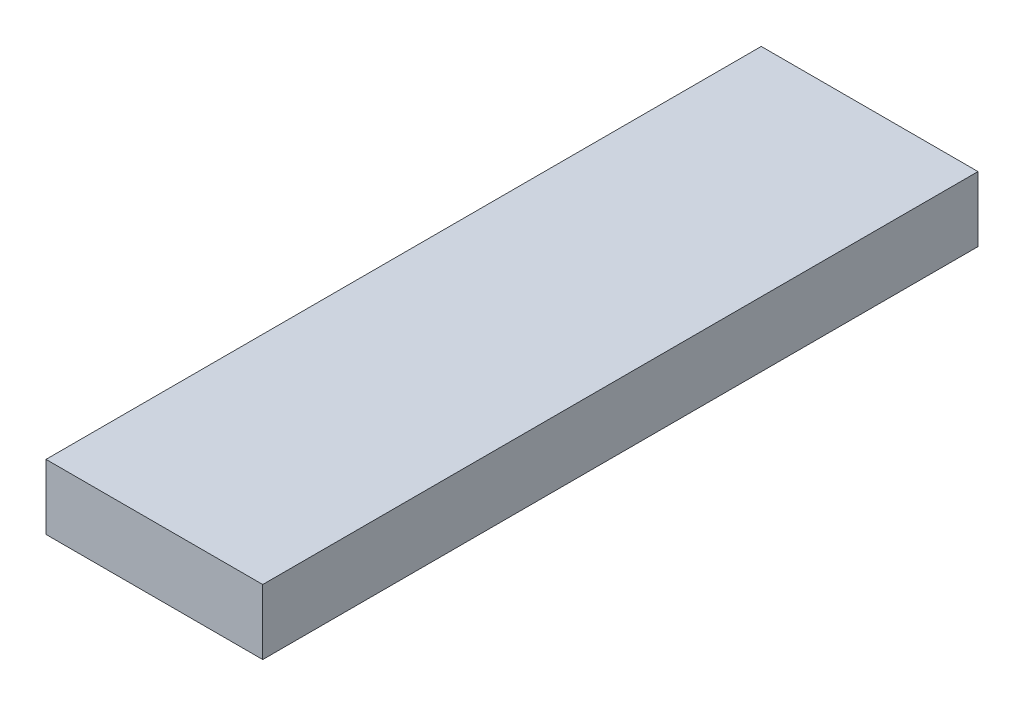
ISO-10303-21;
HEADER;
FILE_DESCRIPTION(('STEP AP214'),'2;1');
FILE_NAME('part.step','',(''),(''),'','','');
FILE_SCHEMA(('AUTOMOTIVE_DESIGN { 1 0 10303 214 1 1 1 1 }'));
ENDSEC;
DATA;
#1=APPLICATION_CONTEXT('core data for automotive mechanical design processes');
#2=APPLICATION_PROTOCOL_DEFINITION('international standard','automotive_design',2000,#1);
#3=PRODUCT_CONTEXT('',#1,'mechanical');
#4=PRODUCT('Part','Part','',(#3));
#5=PRODUCT_RELATED_PRODUCT_CATEGORY('part','',(#4));
#6=PRODUCT_DEFINITION_FORMATION('','',#4);
#7=PRODUCT_DEFINITION_CONTEXT('part definition',#1,'design');
#8=PRODUCT_DEFINITION('design','',#6,#7);
#9=PRODUCT_DEFINITION_SHAPE('','',#8);
#10=(LENGTH_UNIT() NAMED_UNIT(*) SI_UNIT(.MILLI.,.METRE.));
#11=(NAMED_UNIT(*) PLANE_ANGLE_UNIT() SI_UNIT($,.RADIAN.));
#12=(NAMED_UNIT(*) SI_UNIT($,.STERADIAN.) SOLID_ANGLE_UNIT());
#13=UNCERTAINTY_MEASURE_WITH_UNIT(LENGTH_MEASURE(1.E-05),#10,'distance_accuracy_value','');
#14=(GEOMETRIC_REPRESENTATION_CONTEXT(3) GLOBAL_UNCERTAINTY_ASSIGNED_CONTEXT((#13)) GLOBAL_UNIT_ASSIGNED_CONTEXT((#10,
#11,#12)) REPRESENTATION_CONTEXT('',''));
#15=CARTESIAN_POINT('',(0.,0.,0.));
#16=DIRECTION('',(0.,0.,1.));
#17=DIRECTION('',(1.,0.,0.));
#18=AXIS2_PLACEMENT_3D('',#15,#16,#17);
#19=CARTESIAN_POINT('',(5.,3.,16.5));
#20=DIRECTION('',(-1.,0.,0.));
#21=DIRECTION('',(0.,0.,1.));
#22=AXIS2_PLACEMENT_3D('',#19,#20,#21);
#23=PLANE('',#22);
#24=DIRECTION('',(0.,0.,-1.));
#25=VECTOR('',#24,1.);
#26=CARTESIAN_POINT('',(5.,0.,16.5));
#27=LINE('',#26,#25);
#28=CARTESIAN_POINT('',(5.,0.,16.5));
#29=VERTEX_POINT('',#28);
#30=CARTESIAN_POINT('',(5.,0.,-16.5));
#31=VERTEX_POINT('',#30);
#32=EDGE_CURVE('E96',#29,#31,#27,.T.);
#33=ORIENTED_EDGE('',*,*,#32,.T.);
#34=DIRECTION('',(0.,-1.,0.));
#35=VECTOR('',#34,1.);
#36=CARTESIAN_POINT('',(5.,3.,-16.5));
#37=LINE('',#36,#35);
#38=CARTESIAN_POINT('',(5.,3.,-16.5));
#39=VERTEX_POINT('',#38);
#40=EDGE_CURVE('E11',#39,#31,#37,.T.);
#41=ORIENTED_EDGE('',*,*,#40,.F.);
#42=DIRECTION('',(0.,0.,-1.));
#43=VECTOR('',#42,1.);
#44=CARTESIAN_POINT('',(5.,3.,16.5));
#45=LINE('',#44,#43);
#46=CARTESIAN_POINT('',(5.,3.,16.5));
#47=VERTEX_POINT('',#46);
#48=EDGE_CURVE('E84',#47,#39,#45,.T.);
#49=ORIENTED_EDGE('',*,*,#48,.F.);
#50=DIRECTION('',(0.,-1.,0.));
#51=VECTOR('',#50,1.);
#52=CARTESIAN_POINT('',(5.,3.,16.5));
#53=LINE('',#52,#51);
#54=EDGE_CURVE('E92',#47,#29,#53,.T.);
#55=ORIENTED_EDGE('',*,*,#54,.T.);
#56=EDGE_LOOP('',(#33,#41,#49,#55));
#57=FACE_BOUND('',#56,.T.);
#58=ADVANCED_FACE('F33',(#57),#23,.F.);
#59=CARTESIAN_POINT('',(-5.,3.,-16.5));
#60=DIRECTION('',(0.,0.,1.));
#61=DIRECTION('',(1.,0.,0.));
#62=AXIS2_PLACEMENT_3D('',#59,#60,#61);
#63=PLANE('',#62);
#64=DIRECTION('',(-1.,0.,0.));
#65=VECTOR('',#64,1.);
#66=CARTESIAN_POINT('',(-5.,0.,-16.5));
#67=LINE('',#66,#65);
#68=CARTESIAN_POINT('',(-5.,0.,-16.5));
#69=VERTEX_POINT('',#68);
#70=EDGE_CURVE('E88',#31,#69,#67,.T.);
#71=ORIENTED_EDGE('',*,*,#70,.T.);
#72=DIRECTION('',(0.,-1.,0.));
#73=VECTOR('',#72,1.);
#74=CARTESIAN_POINT('',(-5.,3.,-16.5));
#75=LINE('',#74,#73);
#76=CARTESIAN_POINT('',(-5.,3.,-16.5));
#77=VERTEX_POINT('',#76);
#78=EDGE_CURVE('E41',#77,#69,#75,.T.);
#79=ORIENTED_EDGE('',*,*,#78,.F.);
#80=DIRECTION('',(-1.,0.,0.));
#81=VECTOR('',#80,1.);
#82=CARTESIAN_POINT('',(-5.,3.,-16.5));
#83=LINE('',#82,#81);
#84=EDGE_CURVE('E79',#39,#77,#83,.T.);
#85=ORIENTED_EDGE('',*,*,#84,.F.);
#86=ORIENTED_EDGE('',*,*,#40,.T.);
#87=EDGE_LOOP('',(#71,#79,#85,#86));
#88=FACE_BOUND('',#87,.T.);
#89=ADVANCED_FACE('F87',(#88),#63,.F.);
#90=CARTESIAN_POINT('',(-5.,3.,16.5));
#91=DIRECTION('',(1.,0.,0.));
#92=DIRECTION('',(0.,0.,-1.));
#93=AXIS2_PLACEMENT_3D('',#90,#91,#92);
#94=PLANE('',#93);
#95=DIRECTION('',(0.,0.,1.));
#96=VECTOR('',#95,1.);
#97=CARTESIAN_POINT('',(-5.,0.,16.5));
#98=LINE('',#97,#96);
#99=CARTESIAN_POINT('',(-5.,0.,16.5));
#100=VERTEX_POINT('',#99);
#101=EDGE_CURVE('E66',#69,#100,#98,.T.);
#102=ORIENTED_EDGE('',*,*,#101,.T.);
#103=DIRECTION('',(0.,-1.,0.));
#104=VECTOR('',#103,1.);
#105=CARTESIAN_POINT('',(-5.,3.,16.5));
#106=LINE('',#105,#104);
#107=CARTESIAN_POINT('',(-5.,3.,16.5));
#108=VERTEX_POINT('',#107);
#109=EDGE_CURVE('E89',#108,#100,#106,.T.);
#110=ORIENTED_EDGE('',*,*,#109,.F.);
#111=DIRECTION('',(0.,0.,1.));
#112=VECTOR('',#111,1.);
#113=CARTESIAN_POINT('',(-5.,3.,16.5));
#114=LINE('',#113,#112);
#115=EDGE_CURVE('E82',#77,#108,#114,.T.);
#116=ORIENTED_EDGE('',*,*,#115,.F.);
#117=ORIENTED_EDGE('',*,*,#78,.T.);
#118=EDGE_LOOP('',(#102,#110,#116,#117));
#119=FACE_BOUND('',#118,.T.);
#120=ADVANCED_FACE('F90',(#119),#94,.F.);
#121=CARTESIAN_POINT('',(-5.,3.,16.5));
#122=DIRECTION('',(0.,0.,-1.));
#123=DIRECTION('',(-1.,0.,0.));
#124=AXIS2_PLACEMENT_3D('',#121,#122,#123);
#125=PLANE('',#124);
#126=DIRECTION('',(1.,0.,0.));
#127=VECTOR('',#126,1.);
#128=CARTESIAN_POINT('',(-5.,0.,16.5));
#129=LINE('',#128,#127);
#130=EDGE_CURVE('E72',#100,#29,#129,.T.);
#131=ORIENTED_EDGE('',*,*,#130,.T.);
#132=ORIENTED_EDGE('',*,*,#54,.F.);
#133=DIRECTION('',(1.,0.,0.));
#134=VECTOR('',#133,1.);
#135=CARTESIAN_POINT('',(-5.,3.,16.5));
#136=LINE('',#135,#134);
#137=EDGE_CURVE('E49',#108,#47,#136,.T.);
#138=ORIENTED_EDGE('',*,*,#137,.F.);
#139=ORIENTED_EDGE('',*,*,#109,.T.);
#140=EDGE_LOOP('',(#131,#132,#138,#139));
#141=FACE_BOUND('',#140,.T.);
#142=ADVANCED_FACE('F103',(#141),#125,.F.);
#143=CARTESIAN_POINT('',(0.,3.,0.));
#144=DIRECTION('',(0.,-1.,0.));
#145=DIRECTION('',(0.,0.,-1.));
#146=AXIS2_PLACEMENT_3D('',#143,#144,#145);
#147=PLANE('',#146);
#148=ORIENTED_EDGE('',*,*,#48,.T.);
#149=ORIENTED_EDGE('',*,*,#84,.T.);
#150=ORIENTED_EDGE('',*,*,#115,.T.);
#151=ORIENTED_EDGE('',*,*,#137,.T.);
#152=EDGE_LOOP('',(#148,#149,#150,#151));
#153=FACE_BOUND('',#152,.T.);
#154=ADVANCED_FACE('F80',(#153),#147,.F.);
#155=CARTESIAN_POINT('',(0.,0.,0.));
#156=DIRECTION('',(0.,-1.,0.));
#157=DIRECTION('',(0.,0.,-1.));
#158=AXIS2_PLACEMENT_3D('',#155,#156,#157);
#159=PLANE('',#158);
#160=ORIENTED_EDGE('',*,*,#32,.F.);
#161=ORIENTED_EDGE('',*,*,#130,.F.);
#162=ORIENTED_EDGE('',*,*,#101,.F.);
#163=ORIENTED_EDGE('',*,*,#70,.F.);
#164=EDGE_LOOP('',(#160,#161,#162,#163));
#165=FACE_BOUND('',#164,.T.);
#166=ADVANCED_FACE('F106',(#165),#159,.T.);
#167=CLOSED_SHELL('',(#58,#89,#120,#142,#154,#166));
#168=MANIFOLD_SOLID_BREP('B2',#167);
#169=ADVANCED_BREP_SHAPE_REPRESENTATION('',(#18,#168),#14);
#170=SHAPE_DEFINITION_REPRESENTATION(#9,#169);
ENDSEC;
END-ISO-10303-21;
